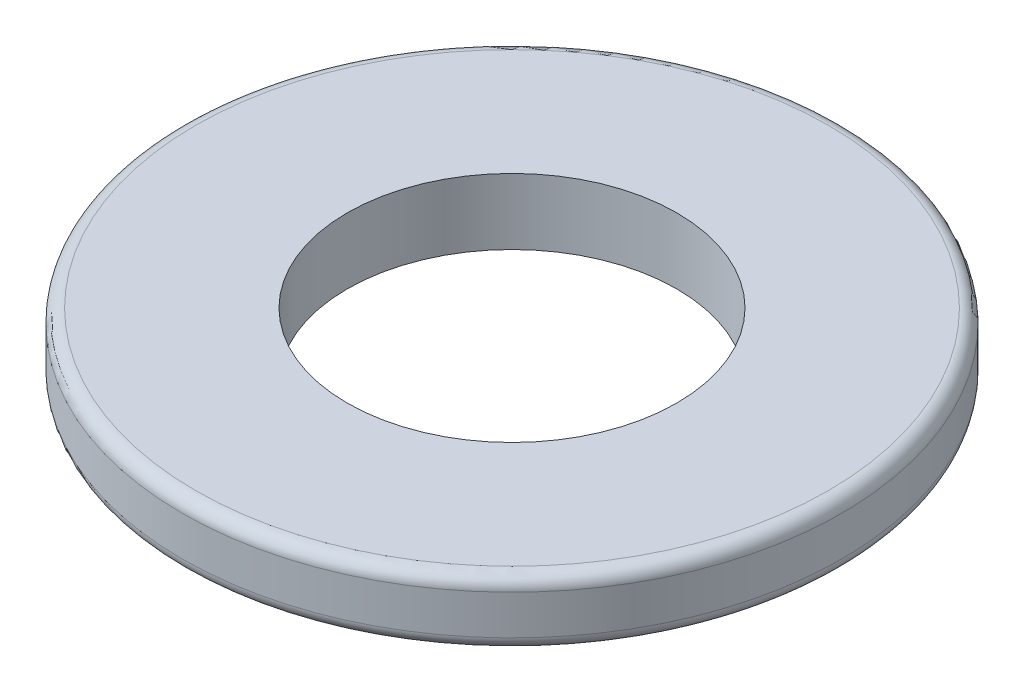
ISO-10303-21;
HEADER;
FILE_DESCRIPTION(('STEP AP214'),'2;1');
FILE_NAME('part.step','',(''),(''),'','','');
FILE_SCHEMA(('AUTOMOTIVE_DESIGN { 1 0 10303 214 1 1 1 1 }'));
ENDSEC;
DATA;
#1=APPLICATION_CONTEXT('core data for automotive mechanical design processes');
#2=APPLICATION_PROTOCOL_DEFINITION('international standard','automotive_design',2000,#1);
#3=PRODUCT_CONTEXT('',#1,'mechanical');
#4=PRODUCT('Part','Part','',(#3));
#5=PRODUCT_RELATED_PRODUCT_CATEGORY('part','',(#4));
#6=PRODUCT_DEFINITION_FORMATION('','',#4);
#7=PRODUCT_DEFINITION_CONTEXT('part definition',#1,'design');
#8=PRODUCT_DEFINITION('design','',#6,#7);
#9=PRODUCT_DEFINITION_SHAPE('','',#8);
#10=(LENGTH_UNIT() NAMED_UNIT(*) SI_UNIT(.MILLI.,.METRE.));
#11=(NAMED_UNIT(*) PLANE_ANGLE_UNIT() SI_UNIT($,.RADIAN.));
#12=(NAMED_UNIT(*) SI_UNIT($,.STERADIAN.) SOLID_ANGLE_UNIT());
#13=UNCERTAINTY_MEASURE_WITH_UNIT(LENGTH_MEASURE(1.E-05),#10,'distance_accuracy_value','');
#14=(GEOMETRIC_REPRESENTATION_CONTEXT(3) GLOBAL_UNCERTAINTY_ASSIGNED_CONTEXT((#13)) GLOBAL_UNIT_ASSIGNED_CONTEXT((#10,
#11,#12)) REPRESENTATION_CONTEXT('',''));
#15=CARTESIAN_POINT('',(0.,0.,0.));
#16=DIRECTION('',(0.,0.,1.));
#17=DIRECTION('',(1.,0.,0.));
#18=AXIS2_PLACEMENT_3D('',#15,#16,#17);
#19=CARTESIAN_POINT('',(0.,0.5,0.));
#20=DIRECTION('',(0.,1.,0.));
#21=DIRECTION('',(0.,0.,1.));
#22=AXIS2_PLACEMENT_3D('',#19,#20,#21);
#23=PLANE('',#22);
#24=CARTESIAN_POINT('',(0.,0.5,0.));
#25=DIRECTION('',(0.,1.,0.));
#26=DIRECTION('',(0.,0.,1.));
#27=AXIS2_PLACEMENT_3D('',#24,#25,#26);
#28=CIRCLE('',#27,2.4);
#29=CARTESIAN_POINT('',(0.,0.5,2.4));
#30=VERTEX_POINT('',#29);
#31=EDGE_CURVE('E10',#30,#30,#28,.T.);
#32=ORIENTED_EDGE('',*,*,#31,.T.);
#33=EDGE_LOOP('',(#32));
#34=FACE_BOUND('',#33,.T.);
#35=CARTESIAN_POINT('',(0.,0.5,0.));
#36=DIRECTION('',(0.,1.,0.));
#37=DIRECTION('',(0.,0.,1.));
#38=AXIS2_PLACEMENT_3D('',#35,#36,#37);
#39=CIRCLE('',#38,1.25);
#40=CARTESIAN_POINT('',(0.,0.5,1.25));
#41=VERTEX_POINT('',#40);
#42=EDGE_CURVE('E54',#41,#41,#39,.T.);
#43=ORIENTED_EDGE('',*,*,#42,.F.);
#44=EDGE_LOOP('',(#43));
#45=FACE_BOUND('',#44,.T.);
#46=ADVANCED_FACE('F34',(#34,#45),#23,.T.);
#47=CARTESIAN_POINT('',(0.,0.,0.));
#48=DIRECTION('',(0.,1.,0.));
#49=DIRECTION('',(0.,0.,1.));
#50=AXIS2_PLACEMENT_3D('',#47,#48,#49);
#51=PLANE('',#50);
#52=CARTESIAN_POINT('',(0.,0.,0.));
#53=DIRECTION('',(0.,1.,0.));
#54=DIRECTION('',(0.,0.,1.));
#55=AXIS2_PLACEMENT_3D('',#52,#53,#54);
#56=CIRCLE('',#55,2.4);
#57=CARTESIAN_POINT('',(0.,0.,2.4));
#58=VERTEX_POINT('',#57);
#59=EDGE_CURVE('E41',#58,#58,#56,.F.);
#60=ORIENTED_EDGE('',*,*,#59,.T.);
#61=EDGE_LOOP('',(#60));
#62=FACE_BOUND('',#61,.T.);
#63=CARTESIAN_POINT('',(0.,0.,0.));
#64=DIRECTION('',(0.,1.,0.));
#65=DIRECTION('',(0.,0.,1.));
#66=AXIS2_PLACEMENT_3D('',#63,#64,#65);
#67=CIRCLE('',#66,1.25);
#68=CARTESIAN_POINT('',(0.,0.,1.25));
#69=VERTEX_POINT('',#68);
#70=EDGE_CURVE('E55',#69,#69,#67,.T.);
#71=ORIENTED_EDGE('',*,*,#70,.T.);
#72=EDGE_LOOP('',(#71));
#73=FACE_BOUND('',#72,.T.);
#74=ADVANCED_FACE('F65',(#62,#73),#51,.F.);
#75=CARTESIAN_POINT('',(0.,0.5,0.));
#76=DIRECTION('',(0.,-1.,0.));
#77=DIRECTION('',(0.,0.,-1.));
#78=AXIS2_PLACEMENT_3D('',#75,#76,#77);
#79=CYLINDRICAL_SURFACE('',#78,2.5);
#80=CARTESIAN_POINT('',(0.,0.1,0.));
#81=DIRECTION('',(0.,1.,0.));
#82=DIRECTION('',(0.,0.,1.));
#83=AXIS2_PLACEMENT_3D('',#80,#81,#82);
#84=CIRCLE('',#83,2.5);
#85=CARTESIAN_POINT('',(0.,0.1,2.5));
#86=VERTEX_POINT('',#85);
#87=EDGE_CURVE('E45',#86,#86,#84,.T.);
#88=ORIENTED_EDGE('',*,*,#87,.T.);
#89=EDGE_LOOP('',(#88));
#90=FACE_BOUND('',#89,.T.);
#91=CARTESIAN_POINT('',(0.,0.4,0.));
#92=DIRECTION('',(0.,1.,0.));
#93=DIRECTION('',(0.,0.,1.));
#94=AXIS2_PLACEMENT_3D('',#91,#92,#93);
#95=CIRCLE('',#94,2.5);
#96=CARTESIAN_POINT('',(0.,0.4,2.5));
#97=VERTEX_POINT('',#96);
#98=EDGE_CURVE('E49',#97,#97,#95,.F.);
#99=ORIENTED_EDGE('',*,*,#98,.T.);
#100=EDGE_LOOP('',(#99));
#101=FACE_BOUND('',#100,.T.);
#102=ADVANCED_FACE('F70',(#90,#101),#79,.T.);
#103=CARTESIAN_POINT('',(0.,0.5,0.));
#104=DIRECTION('',(0.,-1.,0.));
#105=DIRECTION('',(0.,0.,-1.));
#106=AXIS2_PLACEMENT_3D('',#103,#104,#105);
#107=CYLINDRICAL_SURFACE('',#106,1.25);
#108=ORIENTED_EDGE('',*,*,#42,.T.);
#109=EDGE_LOOP('',(#108));
#110=FACE_BOUND('',#109,.T.);
#111=ORIENTED_EDGE('',*,*,#70,.F.);
#112=EDGE_LOOP('',(#111));
#113=FACE_BOUND('',#112,.T.);
#114=ADVANCED_FACE('F61',(#110,#113),#107,.F.);
#115=CARTESIAN_POINT('',(0.,0.1,0.));
#116=DIRECTION('',(0.,1.,0.));
#117=DIRECTION('',(0.,0.,1.));
#118=AXIS2_PLACEMENT_3D('',#115,#116,#117);
#119=TOROIDAL_SURFACE('',#118,2.4,0.1);
#120=ORIENTED_EDGE('',*,*,#59,.F.);
#121=EDGE_LOOP('',(#120));
#122=FACE_BOUND('',#121,.T.);
#123=ORIENTED_EDGE('',*,*,#87,.F.);
#124=EDGE_LOOP('',(#123));
#125=FACE_BOUND('',#124,.T.);
#126=ADVANCED_FACE('F76',(#122,#125),#119,.T.);
#127=CARTESIAN_POINT('',(0.,0.4,0.));
#128=DIRECTION('',(0.,1.,0.));
#129=DIRECTION('',(0.,0.,1.));
#130=AXIS2_PLACEMENT_3D('',#127,#128,#129);
#131=TOROIDAL_SURFACE('',#130,2.4,0.1);
#132=ORIENTED_EDGE('',*,*,#98,.F.);
#133=EDGE_LOOP('',(#132));
#134=FACE_BOUND('',#133,.T.);
#135=ORIENTED_EDGE('',*,*,#31,.F.);
#136=EDGE_LOOP('',(#135));
#137=FACE_BOUND('',#136,.T.);
#138=ADVANCED_FACE('F36',(#134,#137),#131,.T.);
#139=CLOSED_SHELL('',(#46,#74,#102,#114,#126,#138));
#140=MANIFOLD_SOLID_BREP('B2',#139);
#141=ADVANCED_BREP_SHAPE_REPRESENTATION('',(#18,#140),#14);
#142=SHAPE_DEFINITION_REPRESENTATION(#9,#141);
ENDSEC;
END-ISO-10303-21;
